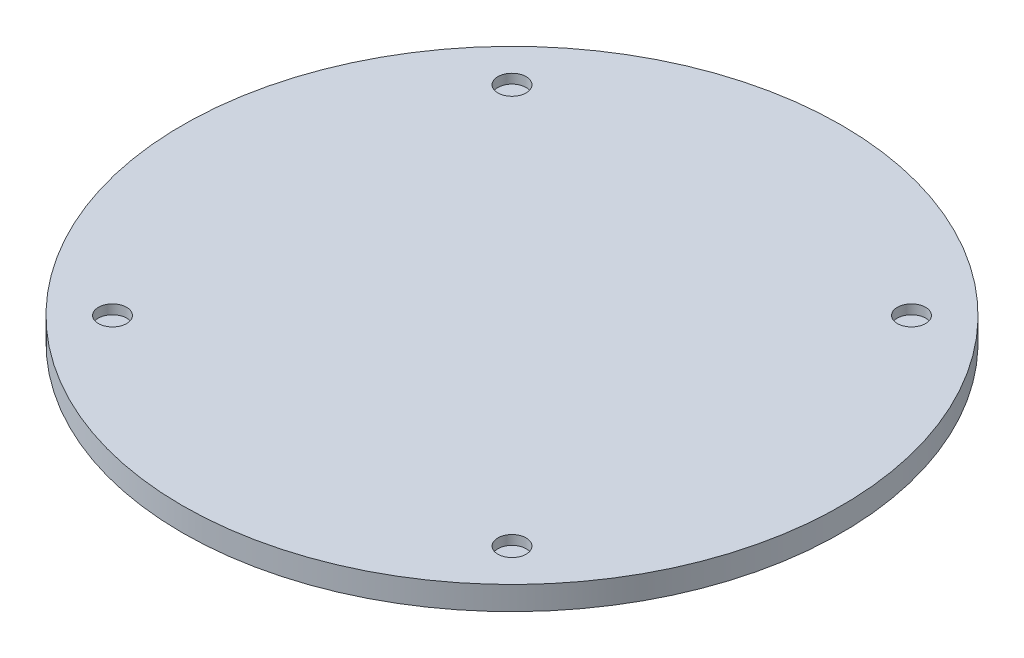
ISO-10303-21;
HEADER;
FILE_DESCRIPTION(('STEP AP214'),'2;1');
FILE_NAME('part.step','',(''),(''),'','','');
FILE_SCHEMA(('AUTOMOTIVE_DESIGN { 1 0 10303 214 1 1 1 1 }'));
ENDSEC;
DATA;
#1=APPLICATION_CONTEXT('core data for automotive mechanical design processes');
#2=APPLICATION_PROTOCOL_DEFINITION('international standard','automotive_design',2000,#1);
#3=PRODUCT_CONTEXT('',#1,'mechanical');
#4=PRODUCT('Part','Part','',(#3));
#5=PRODUCT_RELATED_PRODUCT_CATEGORY('part','',(#4));
#6=PRODUCT_DEFINITION_FORMATION('','',#4);
#7=PRODUCT_DEFINITION_CONTEXT('part definition',#1,'design');
#8=PRODUCT_DEFINITION('design','',#6,#7);
#9=PRODUCT_DEFINITION_SHAPE('','',#8);
#10=(LENGTH_UNIT() NAMED_UNIT(*) SI_UNIT(.MILLI.,.METRE.));
#11=(NAMED_UNIT(*) PLANE_ANGLE_UNIT() SI_UNIT($,.RADIAN.));
#12=(NAMED_UNIT(*) SI_UNIT($,.STERADIAN.) SOLID_ANGLE_UNIT());
#13=UNCERTAINTY_MEASURE_WITH_UNIT(LENGTH_MEASURE(1.E-05),#10,'distance_accuracy_value','');
#14=(GEOMETRIC_REPRESENTATION_CONTEXT(3) GLOBAL_UNCERTAINTY_ASSIGNED_CONTEXT((#13)) GLOBAL_UNIT_ASSIGNED_CONTEXT((#10,
#11,#12)) REPRESENTATION_CONTEXT('',''));
#15=CARTESIAN_POINT('',(0.,0.,0.));
#16=DIRECTION('',(0.,0.,1.));
#17=DIRECTION('',(1.,0.,0.));
#18=AXIS2_PLACEMENT_3D('',#15,#16,#17);
#19=CARTESIAN_POINT('',(0.,5.,0.));
#20=DIRECTION('',(0.,-1.,0.));
#21=DIRECTION('',(0.,0.,-1.));
#22=AXIS2_PLACEMENT_3D('',#19,#20,#21);
#23=CYLINDRICAL_SURFACE('',#22,70.);
#24=CARTESIAN_POINT('',(0.,5.,0.));
#25=DIRECTION('',(0.,1.,0.));
#26=DIRECTION('',(0.,0.,1.));
#27=AXIS2_PLACEMENT_3D('',#24,#25,#26);
#28=CIRCLE('',#27,70.);
#29=CARTESIAN_POINT('',(0.,5.,70.));
#30=VERTEX_POINT('',#29);
#31=EDGE_CURVE('E10',#30,#30,#28,.T.);
#32=ORIENTED_EDGE('',*,*,#31,.F.);
#33=EDGE_LOOP('',(#32));
#34=FACE_BOUND('',#33,.T.);
#35=CARTESIAN_POINT('',(0.,0.,0.));
#36=DIRECTION('',(0.,1.,0.));
#37=DIRECTION('',(0.,0.,1.));
#38=AXIS2_PLACEMENT_3D('',#35,#36,#37);
#39=CIRCLE('',#38,70.);
#40=CARTESIAN_POINT('',(0.,0.,70.));
#41=VERTEX_POINT('',#40);
#42=EDGE_CURVE('E42',#41,#41,#39,.T.);
#43=ORIENTED_EDGE('',*,*,#42,.T.);
#44=EDGE_LOOP('',(#43));
#45=FACE_BOUND('',#44,.T.);
#46=ADVANCED_FACE('F39',(#34,#45),#23,.T.);
#47=CARTESIAN_POINT('',(0.,5.,0.));
#48=DIRECTION('',(0.,1.,0.));
#49=DIRECTION('',(0.,0.,1.));
#50=AXIS2_PLACEMENT_3D('',#47,#48,#49);
#51=PLANE('',#50);
#52=CARTESIAN_POINT('',(42.4264068711928,5.,-42.4264068711928));
#53=DIRECTION('',(0.,1.,0.));
#54=DIRECTION('',(0.,0.,1.));
#55=AXIS2_PLACEMENT_3D('',#52,#53,#54);
#56=CIRCLE('',#55,3.);
#57=CARTESIAN_POINT('',(42.4264068711928,5.,-39.4264068711928));
#58=VERTEX_POINT('',#57);
#59=EDGE_CURVE('E54',#58,#58,#56,.T.);
#60=ORIENTED_EDGE('',*,*,#59,.F.);
#61=EDGE_LOOP('',(#60));
#62=FACE_BOUND('',#61,.T.);
#63=CARTESIAN_POINT('',(-42.4264068711928,5.,42.4264068711928));
#64=DIRECTION('',(0.,1.,0.));
#65=DIRECTION('',(0.,0.,1.));
#66=AXIS2_PLACEMENT_3D('',#63,#64,#65);
#67=CIRCLE('',#66,3.);
#68=CARTESIAN_POINT('',(-42.4264068711928,5.,45.4264068711928));
#69=VERTEX_POINT('',#68);
#70=EDGE_CURVE('E60',#69,#69,#67,.T.);
#71=ORIENTED_EDGE('',*,*,#70,.F.);
#72=EDGE_LOOP('',(#71));
#73=FACE_BOUND('',#72,.T.);
#74=CARTESIAN_POINT('',(42.4264068711928,5.,42.4264068711928));
#75=DIRECTION('',(0.,1.,0.));
#76=DIRECTION('',(0.,0.,1.));
#77=AXIS2_PLACEMENT_3D('',#74,#75,#76);
#78=CIRCLE('',#77,3.);
#79=CARTESIAN_POINT('',(42.4264068711928,5.,45.4264068711928));
#80=VERTEX_POINT('',#79);
#81=EDGE_CURVE('E61',#80,#80,#78,.T.);
#82=ORIENTED_EDGE('',*,*,#81,.F.);
#83=EDGE_LOOP('',(#82));
#84=FACE_BOUND('',#83,.T.);
#85=CARTESIAN_POINT('',(-42.4264068711928,5.,-42.4264068711928));
#86=DIRECTION('',(0.,1.,0.));
#87=DIRECTION('',(0.,0.,1.));
#88=AXIS2_PLACEMENT_3D('',#85,#86,#87);
#89=CIRCLE('',#88,3.);
#90=CARTESIAN_POINT('',(-42.4264068711928,5.,-39.4264068711928));
#91=VERTEX_POINT('',#90);
#92=EDGE_CURVE('E51',#91,#91,#89,.T.);
#93=ORIENTED_EDGE('',*,*,#92,.F.);
#94=EDGE_LOOP('',(#93));
#95=FACE_BOUND('',#94,.T.);
#96=ORIENTED_EDGE('',*,*,#31,.T.);
#97=EDGE_LOOP('',(#96));
#98=FACE_BOUND('',#97,.T.);
#99=ADVANCED_FACE('F77',(#62,#73,#84,#95,#98),#51,.T.);
#100=CARTESIAN_POINT('',(0.,0.,0.));
#101=DIRECTION('',(0.,1.,0.));
#102=DIRECTION('',(0.,0.,1.));
#103=AXIS2_PLACEMENT_3D('',#100,#101,#102);
#104=PLANE('',#103);
#105=ORIENTED_EDGE('',*,*,#42,.F.);
#106=EDGE_LOOP('',(#105));
#107=FACE_BOUND('',#106,.T.);
#108=ADVANCED_FACE('F80',(#107),#104,.F.);
#109=CARTESIAN_POINT('',(-42.4264068711928,3.,-42.4264068711928));
#110=DIRECTION('',(0.,1.,0.));
#111=DIRECTION('',(0.,0.,1.));
#112=AXIS2_PLACEMENT_3D('',#109,#110,#111);
#113=CYLINDRICAL_SURFACE('',#112,3.);
#114=CARTESIAN_POINT('',(-42.4264068711928,3.,-42.4264068711928));
#115=DIRECTION('',(0.,1.,0.));
#116=DIRECTION('',(0.,0.,1.));
#117=AXIS2_PLACEMENT_3D('',#114,#115,#116);
#118=CIRCLE('',#117,3.);
#119=CARTESIAN_POINT('',(-42.4264068711928,3.,-39.4264068711928));
#120=VERTEX_POINT('',#119);
#121=EDGE_CURVE('E49',#120,#120,#118,.T.);
#122=ORIENTED_EDGE('',*,*,#121,.F.);
#123=EDGE_LOOP('',(#122));
#124=FACE_BOUND('',#123,.T.);
#125=ORIENTED_EDGE('',*,*,#92,.T.);
#126=EDGE_LOOP('',(#125));
#127=FACE_BOUND('',#126,.T.);
#128=ADVANCED_FACE('F85',(#124,#127),#113,.F.);
#129=CARTESIAN_POINT('',(-42.4264068711928,3.,-42.4264068711928));
#130=DIRECTION('',(0.,1.,0.));
#131=DIRECTION('',(0.,0.,1.));
#132=AXIS2_PLACEMENT_3D('',#129,#130,#131);
#133=PLANE('',#132);
#134=ORIENTED_EDGE('',*,*,#121,.T.);
#135=EDGE_LOOP('',(#134));
#136=FACE_BOUND('',#135,.T.);
#137=ADVANCED_FACE('F87',(#136),#133,.T.);
#138=CARTESIAN_POINT('',(42.4264068711928,3.,42.4264068711928));
#139=DIRECTION('',(0.,1.,0.));
#140=DIRECTION('',(0.,0.,1.));
#141=AXIS2_PLACEMENT_3D('',#138,#139,#140);
#142=CYLINDRICAL_SURFACE('',#141,3.);
#143=CARTESIAN_POINT('',(42.4264068711928,3.,42.4264068711928));
#144=DIRECTION('',(0.,1.,0.));
#145=DIRECTION('',(0.,0.,1.));
#146=AXIS2_PLACEMENT_3D('',#143,#144,#145);
#147=CIRCLE('',#146,3.);
#148=CARTESIAN_POINT('',(42.4264068711928,3.,45.4264068711928));
#149=VERTEX_POINT('',#148);
#150=EDGE_CURVE('E69',#149,#149,#147,.T.);
#151=ORIENTED_EDGE('',*,*,#150,.F.);
#152=EDGE_LOOP('',(#151));
#153=FACE_BOUND('',#152,.T.);
#154=ORIENTED_EDGE('',*,*,#81,.T.);
#155=EDGE_LOOP('',(#154));
#156=FACE_BOUND('',#155,.T.);
#157=ADVANCED_FACE('F75',(#153,#156),#142,.F.);
#158=CARTESIAN_POINT('',(42.4264068711928,3.,42.4264068711928));
#159=DIRECTION('',(0.,1.,0.));
#160=DIRECTION('',(0.,0.,1.));
#161=AXIS2_PLACEMENT_3D('',#158,#159,#160);
#162=PLANE('',#161);
#163=ORIENTED_EDGE('',*,*,#150,.T.);
#164=EDGE_LOOP('',(#163));
#165=FACE_BOUND('',#164,.T.);
#166=ADVANCED_FACE('F134',(#165),#162,.T.);
#167=CARTESIAN_POINT('',(-42.4264068711928,3.,42.4264068711928));
#168=DIRECTION('',(0.,1.,0.));
#169=DIRECTION('',(0.,0.,1.));
#170=AXIS2_PLACEMENT_3D('',#167,#168,#169);
#171=CYLINDRICAL_SURFACE('',#170,3.);
#172=CARTESIAN_POINT('',(-42.4264068711928,3.,42.4264068711928));
#173=DIRECTION('',(0.,1.,0.));
#174=DIRECTION('',(0.,0.,1.));
#175=AXIS2_PLACEMENT_3D('',#172,#173,#174);
#176=CIRCLE('',#175,3.);
#177=CARTESIAN_POINT('',(-42.4264068711928,3.,45.4264068711928));
#178=VERTEX_POINT('',#177);
#179=EDGE_CURVE('E57',#178,#178,#176,.T.);
#180=ORIENTED_EDGE('',*,*,#179,.F.);
#181=EDGE_LOOP('',(#180));
#182=FACE_BOUND('',#181,.T.);
#183=ORIENTED_EDGE('',*,*,#70,.T.);
#184=EDGE_LOOP('',(#183));
#185=FACE_BOUND('',#184,.T.);
#186=ADVANCED_FACE('F143',(#182,#185),#171,.F.);
#187=CARTESIAN_POINT('',(-42.4264068711928,3.,42.4264068711928));
#188=DIRECTION('',(0.,1.,0.));
#189=DIRECTION('',(0.,0.,1.));
#190=AXIS2_PLACEMENT_3D('',#187,#188,#189);
#191=PLANE('',#190);
#192=ORIENTED_EDGE('',*,*,#179,.T.);
#193=EDGE_LOOP('',(#192));
#194=FACE_BOUND('',#193,.T.);
#195=ADVANCED_FACE('F152',(#194),#191,.T.);
#196=CARTESIAN_POINT('',(42.4264068711928,3.,-42.4264068711928));
#197=DIRECTION('',(0.,1.,0.));
#198=DIRECTION('',(0.,0.,1.));
#199=AXIS2_PLACEMENT_3D('',#196,#197,#198);
#200=CYLINDRICAL_SURFACE('',#199,3.);
#201=CARTESIAN_POINT('',(42.4264068711928,3.,-42.4264068711928));
#202=DIRECTION('',(0.,1.,0.));
#203=DIRECTION('',(0.,0.,1.));
#204=AXIS2_PLACEMENT_3D('',#201,#202,#203);
#205=CIRCLE('',#204,3.);
#206=CARTESIAN_POINT('',(42.4264068711928,3.,-39.4264068711928));
#207=VERTEX_POINT('',#206);
#208=EDGE_CURVE('E64',#207,#207,#205,.T.);
#209=ORIENTED_EDGE('',*,*,#208,.F.);
#210=EDGE_LOOP('',(#209));
#211=FACE_BOUND('',#210,.T.);
#212=ORIENTED_EDGE('',*,*,#59,.T.);
#213=EDGE_LOOP('',(#212));
#214=FACE_BOUND('',#213,.T.);
#215=ADVANCED_FACE('F161',(#211,#214),#200,.F.);
#216=CARTESIAN_POINT('',(42.4264068711928,3.,-42.4264068711928));
#217=DIRECTION('',(0.,1.,0.));
#218=DIRECTION('',(0.,0.,1.));
#219=AXIS2_PLACEMENT_3D('',#216,#217,#218);
#220=PLANE('',#219);
#221=ORIENTED_EDGE('',*,*,#208,.T.);
#222=EDGE_LOOP('',(#221));
#223=FACE_BOUND('',#222,.T.);
#224=ADVANCED_FACE('F170',(#223),#220,.T.);
#225=CLOSED_SHELL('',(#46,#99,#108,#128,#137,#157,#166,#186,#195,#215,#224));
#226=MANIFOLD_SOLID_BREP('B2',#225);
#227=ADVANCED_BREP_SHAPE_REPRESENTATION('',(#18,#226),#14);
#228=SHAPE_DEFINITION_REPRESENTATION(#9,#227);
ENDSEC;
END-ISO-10303-21;
